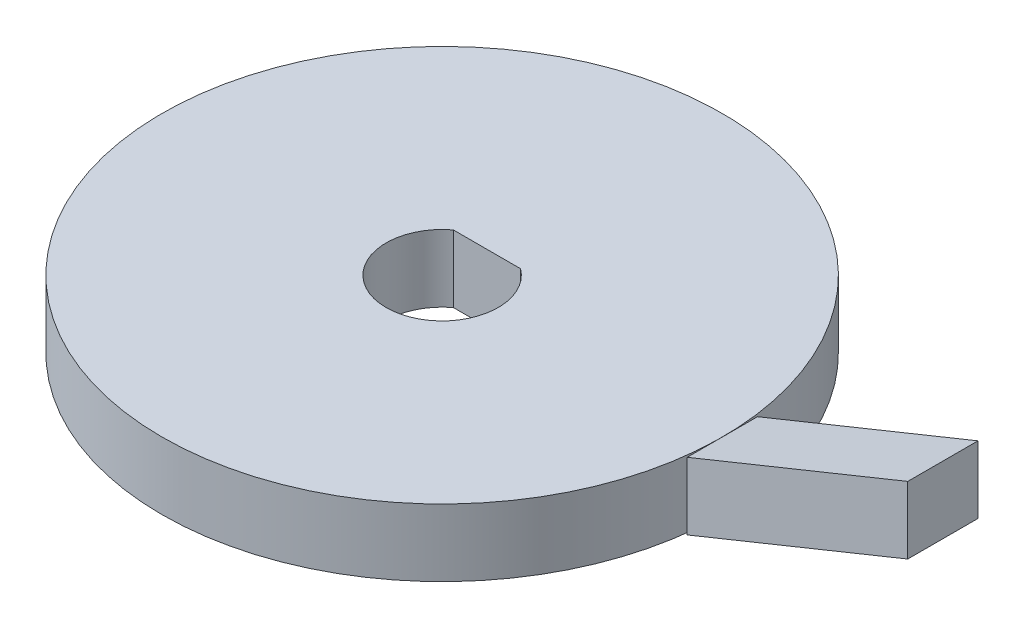
ISO-10303-21;
HEADER;
FILE_DESCRIPTION(('STEP AP214'),'2;1');
FILE_NAME('part.step','',(''),(''),'','','');
FILE_SCHEMA(('AUTOMOTIVE_DESIGN { 1 0 10303 214 1 1 1 1 }'));
ENDSEC;
DATA;
#1=APPLICATION_CONTEXT('core data for automotive mechanical design processes');
#2=APPLICATION_PROTOCOL_DEFINITION('international standard','automotive_design',2000,#1);
#3=PRODUCT_CONTEXT('',#1,'mechanical');
#4=PRODUCT('Part','Part','',(#3));
#5=PRODUCT_RELATED_PRODUCT_CATEGORY('part','',(#4));
#6=PRODUCT_DEFINITION_FORMATION('','',#4);
#7=PRODUCT_DEFINITION_CONTEXT('part definition',#1,'design');
#8=PRODUCT_DEFINITION('design','',#6,#7);
#9=PRODUCT_DEFINITION_SHAPE('','',#8);
#10=(LENGTH_UNIT() NAMED_UNIT(*) SI_UNIT(.MILLI.,.METRE.));
#11=(NAMED_UNIT(*) PLANE_ANGLE_UNIT() SI_UNIT($,.RADIAN.));
#12=(NAMED_UNIT(*) SI_UNIT($,.STERADIAN.) SOLID_ANGLE_UNIT());
#13=UNCERTAINTY_MEASURE_WITH_UNIT(LENGTH_MEASURE(1.E-05),#10,'distance_accuracy_value','');
#14=(GEOMETRIC_REPRESENTATION_CONTEXT(3) GLOBAL_UNCERTAINTY_ASSIGNED_CONTEXT((#13)) GLOBAL_UNIT_ASSIGNED_CONTEXT((#10,
#11,#12)) REPRESENTATION_CONTEXT('',''));
#15=CARTESIAN_POINT('',(0.,0.,0.));
#16=DIRECTION('',(0.,0.,1.));
#17=DIRECTION('',(1.,0.,0.));
#18=AXIS2_PLACEMENT_3D('',#15,#16,#17);
#19=CARTESIAN_POINT('',(22.3361763937504,2.48653525716952,1.56731356063972));
#20=DIRECTION('',(0.,0.,-1.));
#21=DIRECTION('',(-1.,0.,0.));
#22=AXIS2_PLACEMENT_3D('',#19,#20,#21);
#23=PLANE('',#22);
#24=DIRECTION('',(0.,-1.,0.));
#25=VECTOR('',#24,1.);
#26=CARTESIAN_POINT('',(12.5,-1.5,1.56731356063972));
#27=LINE('',#26,#25);
#28=CARTESIAN_POINT('',(12.5,1.5,1.56731356063972));
#29=VERTEX_POINT('',#28);
#30=CARTESIAN_POINT('',(12.5,-1.5,1.56731356063972));
#31=VERTEX_POINT('',#30);
#32=EDGE_CURVE('E106',#29,#31,#27,.T.);
#33=ORIENTED_EDGE('',*,*,#32,.T.);
#34=DIRECTION('',(-0.926775475850384,-0.375615784229435,0.));
#35=VECTOR('',#34,1.);
#36=CARTESIAN_POINT('',(22.3361763937504,2.48653525716952,1.56731356063972));
#37=LINE('',#36,#35);
#38=CARTESIAN_POINT('',(22.3361763937504,2.48653525716952,1.56731356063972));
#39=VERTEX_POINT('',#38);
#40=EDGE_CURVE('E12',#39,#31,#37,.T.);
#41=ORIENTED_EDGE('',*,*,#40,.F.);
#42=DIRECTION('',(0.,-1.,0.));
#43=VECTOR('',#42,1.);
#44=CARTESIAN_POINT('',(22.3361763937504,2.48653525716952,1.56731356063972));
#45=LINE('',#44,#43);
#46=CARTESIAN_POINT('',(22.3361763937504,5.48653525716952,1.56731356063972));
#47=VERTEX_POINT('',#46);
#48=EDGE_CURVE('E94',#47,#39,#45,.T.);
#49=ORIENTED_EDGE('',*,*,#48,.F.);
#50=DIRECTION('',(-0.926775475850384,-0.375615784229435,0.));
#51=VECTOR('',#50,1.);
#52=CARTESIAN_POINT('',(22.3361763937504,5.48653525716952,1.56731356063972));
#53=LINE('',#52,#51);
#54=EDGE_CURVE('E102',#47,#29,#53,.T.);
#55=ORIENTED_EDGE('',*,*,#54,.T.);
#56=EDGE_LOOP('',(#33,#41,#49,#55));
#57=FACE_BOUND('',#56,.T.);
#58=ADVANCED_FACE('F43',(#57),#23,.F.);
#59=CARTESIAN_POINT('',(22.3361763937504,2.48653525716952,-1.56731356063972));
#60=DIRECTION('',(-0.375615784229435,0.926775475850384,0.));
#61=DIRECTION('',(-0.926775475850384,-0.375615784229435,0.));
#62=AXIS2_PLACEMENT_3D('',#59,#60,#61);
#63=PLANE('',#62);
#64=DIRECTION('',(0.,0.,-1.));
#65=VECTOR('',#64,1.);
#66=CARTESIAN_POINT('',(12.5,-1.5,-1.56731356063972));
#67=LINE('',#66,#65);
#68=CARTESIAN_POINT('',(12.5,-1.5,-1.56731356063972));
#69=VERTEX_POINT('',#68);
#70=EDGE_CURVE('E98',#31,#69,#67,.T.);
#71=ORIENTED_EDGE('',*,*,#70,.T.);
#72=DIRECTION('',(-0.926775475850384,-0.375615784229435,0.));
#73=VECTOR('',#72,1.);
#74=CARTESIAN_POINT('',(22.3361763937504,2.48653525716952,-1.56731356063972));
#75=LINE('',#74,#73);
#76=CARTESIAN_POINT('',(22.3361763937504,2.48653525716952,-1.56731356063972));
#77=VERTEX_POINT('',#76);
#78=EDGE_CURVE('E51',#77,#69,#75,.T.);
#79=ORIENTED_EDGE('',*,*,#78,.F.);
#80=DIRECTION('',(0.,0.,-1.));
#81=VECTOR('',#80,1.);
#82=CARTESIAN_POINT('',(22.3361763937504,2.48653525716952,-1.56731356063972));
#83=LINE('',#82,#81);
#84=EDGE_CURVE('E89',#39,#77,#83,.T.);
#85=ORIENTED_EDGE('',*,*,#84,.F.);
#86=ORIENTED_EDGE('',*,*,#40,.T.);
#87=EDGE_LOOP('',(#71,#79,#85,#86));
#88=FACE_BOUND('',#87,.T.);
#89=ADVANCED_FACE('F97',(#88),#63,.F.);
#90=CARTESIAN_POINT('',(22.3361763937504,2.48653525716952,-1.56731356063972));
#91=DIRECTION('',(0.,0.,1.));
#92=DIRECTION('',(1.,0.,0.));
#93=AXIS2_PLACEMENT_3D('',#90,#91,#92);
#94=PLANE('',#93);
#95=DIRECTION('',(0.,1.,0.));
#96=VECTOR('',#95,1.);
#97=CARTESIAN_POINT('',(12.5,-1.5,-1.56731356063972));
#98=LINE('',#97,#96);
#99=CARTESIAN_POINT('',(12.5,1.5,-1.56731356063972));
#100=VERTEX_POINT('',#99);
#101=EDGE_CURVE('E76',#69,#100,#98,.T.);
#102=ORIENTED_EDGE('',*,*,#101,.T.);
#103=DIRECTION('',(-0.926775475850384,-0.375615784229435,0.));
#104=VECTOR('',#103,1.);
#105=CARTESIAN_POINT('',(22.3361763937504,5.48653525716952,-1.56731356063972));
#106=LINE('',#105,#104);
#107=CARTESIAN_POINT('',(22.3361763937504,5.48653525716952,-1.56731356063972));
#108=VERTEX_POINT('',#107);
#109=EDGE_CURVE('E99',#108,#100,#106,.T.);
#110=ORIENTED_EDGE('',*,*,#109,.F.);
#111=DIRECTION('',(0.,1.,0.));
#112=VECTOR('',#111,1.);
#113=CARTESIAN_POINT('',(22.3361763937504,2.48653525716952,-1.56731356063972));
#114=LINE('',#113,#112);
#115=EDGE_CURVE('E92',#77,#108,#114,.T.);
#116=ORIENTED_EDGE('',*,*,#115,.F.);
#117=ORIENTED_EDGE('',*,*,#78,.T.);
#118=EDGE_LOOP('',(#102,#110,#116,#117));
#119=FACE_BOUND('',#118,.T.);
#120=ADVANCED_FACE('F100',(#119),#94,.F.);
#121=CARTESIAN_POINT('',(22.3361763937504,5.48653525716952,-1.56731356063972));
#122=DIRECTION('',(0.375615784229435,-0.926775475850384,0.));
#123=DIRECTION('',(0.926775475850384,0.375615784229435,0.));
#124=AXIS2_PLACEMENT_3D('',#121,#122,#123);
#125=PLANE('',#124);
#126=DIRECTION('',(0.,0.,1.));
#127=VECTOR('',#126,1.);
#128=CARTESIAN_POINT('',(12.5,1.5,-1.56731356063972));
#129=LINE('',#128,#127);
#130=EDGE_CURVE('E82',#100,#29,#129,.T.);
#131=ORIENTED_EDGE('',*,*,#130,.T.);
#132=ORIENTED_EDGE('',*,*,#54,.F.);
#133=DIRECTION('',(0.,0.,1.));
#134=VECTOR('',#133,1.);
#135=CARTESIAN_POINT('',(22.3361763937504,5.48653525716952,-1.56731356063972));
#136=LINE('',#135,#134);
#137=EDGE_CURVE('E59',#108,#47,#136,.T.);
#138=ORIENTED_EDGE('',*,*,#137,.F.);
#139=ORIENTED_EDGE('',*,*,#109,.T.);
#140=EDGE_LOOP('',(#131,#132,#138,#139));
#141=FACE_BOUND('',#140,.T.);
#142=ADVANCED_FACE('F113',(#141),#125,.F.);
#143=CARTESIAN_POINT('',(22.3361763937504,3.98653525716952,0.));
#144=DIRECTION('',(1.,0.,0.));
#145=DIRECTION('',(0.,0.,-1.));
#146=AXIS2_PLACEMENT_3D('',#143,#144,#145);
#147=PLANE('',#146);
#148=ORIENTED_EDGE('',*,*,#48,.T.);
#149=ORIENTED_EDGE('',*,*,#84,.T.);
#150=ORIENTED_EDGE('',*,*,#115,.T.);
#151=ORIENTED_EDGE('',*,*,#137,.T.);
#152=EDGE_LOOP('',(#148,#149,#150,#151));
#153=FACE_BOUND('',#152,.T.);
#154=ADVANCED_FACE('F90',(#153),#147,.T.);
#155=CARTESIAN_POINT('',(12.5,0.,0.));
#156=DIRECTION('',(1.,0.,0.));
#157=DIRECTION('',(0.,0.,-1.));
#158=AXIS2_PLACEMENT_3D('',#155,#156,#157);
#159=PLANE('',#158);
#160=ORIENTED_EDGE('',*,*,#32,.F.);
#161=ORIENTED_EDGE('',*,*,#130,.F.);
#162=ORIENTED_EDGE('',*,*,#101,.F.);
#163=ORIENTED_EDGE('',*,*,#70,.F.);
#164=EDGE_LOOP('',(#160,#161,#162,#163));
#165=FACE_BOUND('',#164,.T.);
#166=ADVANCED_FACE('F116',(#165),#159,.F.);
#167=CLOSED_SHELL('',(#58,#89,#120,#142,#154,#166));
#168=MANIFOLD_SOLID_BREP('B2',#167);
#169=CARTESIAN_POINT('',(0.,1.5,0.));
#170=DIRECTION('',(0.,1.,0.));
#171=DIRECTION('',(0.,0.,1.));
#172=AXIS2_PLACEMENT_3D('',#169,#170,#171);
#173=PLANE('',#172);
#174=CARTESIAN_POINT('',(0.,1.5,0.));
#175=DIRECTION('',(0.,1.,0.));
#176=DIRECTION('',(0.,0.,1.));
#177=AXIS2_PLACEMENT_3D('',#174,#175,#176);
#178=CIRCLE('',#177,12.5);
#179=CARTESIAN_POINT('',(0.,1.5,12.5));
#180=VERTEX_POINT('',#179);
#181=EDGE_CURVE('E41',#180,#180,#178,.T.);
#182=ORIENTED_EDGE('',*,*,#181,.T.);
#183=EDGE_LOOP('',(#182));
#184=FACE_BOUND('',#183,.T.);
#185=DIRECTION('',(-1.,0.,0.));
#186=VECTOR('',#185,1.);
#187=CARTESIAN_POINT('',(-1.5,1.5,-2.));
#188=LINE('',#187,#186);
#189=CARTESIAN_POINT('',(1.5,1.5,-2.));
#190=VERTEX_POINT('',#189);
#191=CARTESIAN_POINT('',(-1.5,1.5,-2.));
#192=VERTEX_POINT('',#191);
#193=EDGE_CURVE('E208',#190,#192,#188,.T.);
#194=ORIENTED_EDGE('',*,*,#193,.F.);
#195=CARTESIAN_POINT('',(0.,1.5,0.));
#196=DIRECTION('',(0.,1.,0.));
#197=DIRECTION('',(0.,0.,1.));
#198=AXIS2_PLACEMENT_3D('',#195,#196,#197);
#199=CIRCLE('',#198,2.5);
#200=EDGE_CURVE('E199',#192,#190,#199,.T.);
#201=ORIENTED_EDGE('',*,*,#200,.F.);
#202=EDGE_LOOP('',(#194,#201));
#203=FACE_BOUND('',#202,.T.);
#204=ADVANCED_FACE('F167',(#184,#203),#173,.T.);
#205=CARTESIAN_POINT('',(0.,-1.5,0.));
#206=DIRECTION('',(0.,1.,0.));
#207=DIRECTION('',(0.,0.,1.));
#208=AXIS2_PLACEMENT_3D('',#205,#206,#207);
#209=PLANE('',#208);
#210=CARTESIAN_POINT('',(0.,-1.5,0.));
#211=DIRECTION('',(0.,1.,0.));
#212=DIRECTION('',(0.,0.,1.));
#213=AXIS2_PLACEMENT_3D('',#210,#211,#212);
#214=CIRCLE('',#213,12.5);
#215=CARTESIAN_POINT('',(0.,-1.5,12.5));
#216=VERTEX_POINT('',#215);
#217=EDGE_CURVE('E171',#216,#216,#214,.T.);
#218=ORIENTED_EDGE('',*,*,#217,.F.);
#219=EDGE_LOOP('',(#218));
#220=FACE_BOUND('',#219,.T.);
#221=CARTESIAN_POINT('',(0.,-1.5,0.));
#222=DIRECTION('',(0.,1.,0.));
#223=DIRECTION('',(0.,0.,1.));
#224=AXIS2_PLACEMENT_3D('',#221,#222,#223);
#225=CIRCLE('',#224,2.5);
#226=CARTESIAN_POINT('',(-1.5,-1.5,-2.));
#227=VERTEX_POINT('',#226);
#228=CARTESIAN_POINT('',(1.5,-1.5,-2.));
#229=VERTEX_POINT('',#228);
#230=EDGE_CURVE('E189',#227,#229,#225,.T.);
#231=ORIENTED_EDGE('',*,*,#230,.T.);
#232=DIRECTION('',(-1.,0.,0.));
#233=VECTOR('',#232,1.);
#234=CARTESIAN_POINT('',(-1.5,-1.5,-2.));
#235=LINE('',#234,#233);
#236=EDGE_CURVE('E195',#229,#227,#235,.T.);
#237=ORIENTED_EDGE('',*,*,#236,.T.);
#238=EDGE_LOOP('',(#231,#237));
#239=FACE_BOUND('',#238,.T.);
#240=ADVANCED_FACE('F205',(#220,#239),#209,.F.);
#241=CARTESIAN_POINT('',(0.,1.5,0.));
#242=DIRECTION('',(0.,-1.,0.));
#243=DIRECTION('',(0.,0.,-1.));
#244=AXIS2_PLACEMENT_3D('',#241,#242,#243);
#245=CYLINDRICAL_SURFACE('',#244,12.5);
#246=ORIENTED_EDGE('',*,*,#181,.F.);
#247=EDGE_LOOP('',(#246));
#248=FACE_BOUND('',#247,.T.);
#249=ORIENTED_EDGE('',*,*,#217,.T.);
#250=EDGE_LOOP('',(#249));
#251=FACE_BOUND('',#250,.T.);
#252=ADVANCED_FACE('F169',(#248,#251),#245,.T.);
#253=CARTESIAN_POINT('',(0.,1.5,0.));
#254=DIRECTION('',(0.,-1.,0.));
#255=DIRECTION('',(0.,0.,-1.));
#256=AXIS2_PLACEMENT_3D('',#253,#254,#255);
#257=CYLINDRICAL_SURFACE('',#256,2.5);
#258=ORIENTED_EDGE('',*,*,#230,.F.);
#259=DIRECTION('',(0.,-1.,0.));
#260=VECTOR('',#259,1.);
#261=CARTESIAN_POINT('',(-1.5,1.5,-2.));
#262=LINE('',#261,#260);
#263=EDGE_CURVE('E197',#192,#227,#262,.T.);
#264=ORIENTED_EDGE('',*,*,#263,.F.);
#265=ORIENTED_EDGE('',*,*,#200,.T.);
#266=DIRECTION('',(0.,-1.,0.));
#267=VECTOR('',#266,1.);
#268=CARTESIAN_POINT('',(1.5,1.5,-2.));
#269=LINE('',#268,#267);
#270=EDGE_CURVE('E182',#190,#229,#269,.T.);
#271=ORIENTED_EDGE('',*,*,#270,.T.);
#272=EDGE_LOOP('',(#258,#264,#265,#271));
#273=FACE_BOUND('',#272,.T.);
#274=ADVANCED_FACE('F201',(#273),#257,.F.);
#275=CARTESIAN_POINT('',(-1.5,1.5,-2.));
#276=DIRECTION('',(0.,0.,1.));
#277=DIRECTION('',(1.,0.,0.));
#278=AXIS2_PLACEMENT_3D('',#275,#276,#277);
#279=PLANE('',#278);
#280=ORIENTED_EDGE('',*,*,#236,.F.);
#281=ORIENTED_EDGE('',*,*,#270,.F.);
#282=ORIENTED_EDGE('',*,*,#193,.T.);
#283=ORIENTED_EDGE('',*,*,#263,.T.);
#284=EDGE_LOOP('',(#280,#281,#282,#283));
#285=FACE_BOUND('',#284,.T.);
#286=ADVANCED_FACE('F196',(#285),#279,.T.);
#287=CLOSED_SHELL('',(#204,#240,#252,#274,#286));
#288=MANIFOLD_SOLID_BREP('B6',#287);
#289=ADVANCED_BREP_SHAPE_REPRESENTATION('',(#18,#168,#288),#14);
#290=SHAPE_DEFINITION_REPRESENTATION(#9,#289);
ENDSEC;
END-ISO-10303-21;
